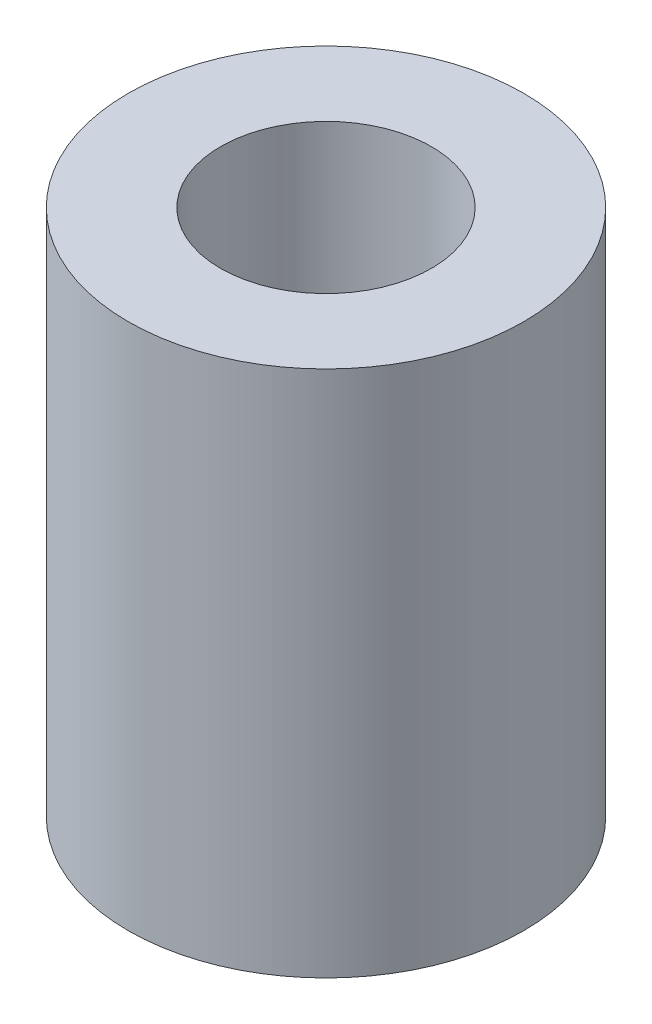
ISO-10303-21;
HEADER;
FILE_DESCRIPTION(('STEP AP214'),'2;1');
FILE_NAME('part.step','',(''),(''),'','','');
FILE_SCHEMA(('AUTOMOTIVE_DESIGN { 1 0 10303 214 1 1 1 1 }'));
ENDSEC;
DATA;
#1=APPLICATION_CONTEXT('core data for automotive mechanical design processes');
#2=APPLICATION_PROTOCOL_DEFINITION('international standard','automotive_design',2000,#1);
#3=PRODUCT_CONTEXT('',#1,'mechanical');
#4=PRODUCT('Part','Part','',(#3));
#5=PRODUCT_RELATED_PRODUCT_CATEGORY('part','',(#4));
#6=PRODUCT_DEFINITION_FORMATION('','',#4);
#7=PRODUCT_DEFINITION_CONTEXT('part definition',#1,'design');
#8=PRODUCT_DEFINITION('design','',#6,#7);
#9=PRODUCT_DEFINITION_SHAPE('','',#8);
#10=(LENGTH_UNIT() NAMED_UNIT(*) SI_UNIT(.MILLI.,.METRE.));
#11=(NAMED_UNIT(*) PLANE_ANGLE_UNIT() SI_UNIT($,.RADIAN.));
#12=(NAMED_UNIT(*) SI_UNIT($,.STERADIAN.) SOLID_ANGLE_UNIT());
#13=UNCERTAINTY_MEASURE_WITH_UNIT(LENGTH_MEASURE(1.E-05),#10,'distance_accuracy_value','');
#14=(GEOMETRIC_REPRESENTATION_CONTEXT(3) GLOBAL_UNCERTAINTY_ASSIGNED_CONTEXT((#13)) GLOBAL_UNIT_ASSIGNED_CONTEXT((#10,
#11,#12)) REPRESENTATION_CONTEXT('',''));
#15=CARTESIAN_POINT('',(0.,0.,0.));
#16=DIRECTION('',(0.,0.,1.));
#17=DIRECTION('',(1.,0.,0.));
#18=AXIS2_PLACEMENT_3D('',#15,#16,#17);
#19=CARTESIAN_POINT('',(0.,-20.,0.));
#20=DIRECTION('',(0.,1.,0.));
#21=DIRECTION('',(0.,0.,1.));
#22=AXIS2_PLACEMENT_3D('',#19,#20,#21);
#23=CYLINDRICAL_SURFACE('',#22,7.5);
#24=CARTESIAN_POINT('',(0.,-20.,0.));
#25=DIRECTION('',(0.,1.,0.));
#26=DIRECTION('',(0.,0.,1.));
#27=AXIS2_PLACEMENT_3D('',#24,#25,#26);
#28=CIRCLE('',#27,7.5);
#29=CARTESIAN_POINT('',(0.,-20.,7.5));
#30=VERTEX_POINT('',#29);
#31=EDGE_CURVE('E10',#30,#30,#28,.T.);
#32=ORIENTED_EDGE('',*,*,#31,.T.);
#33=EDGE_LOOP('',(#32));
#34=FACE_BOUND('',#33,.T.);
#35=CARTESIAN_POINT('',(0.,0.,0.));
#36=DIRECTION('',(0.,1.,0.));
#37=DIRECTION('',(0.,0.,1.));
#38=AXIS2_PLACEMENT_3D('',#35,#36,#37);
#39=CIRCLE('',#38,7.5);
#40=CARTESIAN_POINT('',(0.,0.,7.5));
#41=VERTEX_POINT('',#40);
#42=EDGE_CURVE('E40',#41,#41,#39,.T.);
#43=ORIENTED_EDGE('',*,*,#42,.F.);
#44=EDGE_LOOP('',(#43));
#45=FACE_BOUND('',#44,.T.);
#46=ADVANCED_FACE('F37',(#34,#45),#23,.T.);
#47=CARTESIAN_POINT('',(0.,-20.,0.));
#48=DIRECTION('',(0.,1.,0.));
#49=DIRECTION('',(0.,0.,1.));
#50=AXIS2_PLACEMENT_3D('',#47,#48,#49);
#51=PLANE('',#50);
#52=CARTESIAN_POINT('',(0.,-20.,0.));
#53=DIRECTION('',(0.,1.,0.));
#54=DIRECTION('',(0.,0.,1.));
#55=AXIS2_PLACEMENT_3D('',#52,#53,#54);
#56=CIRCLE('',#55,4.);
#57=CARTESIAN_POINT('',(0.,-20.,4.));
#58=VERTEX_POINT('',#57);
#59=EDGE_CURVE('E49',#58,#58,#56,.T.);
#60=ORIENTED_EDGE('',*,*,#59,.T.);
#61=EDGE_LOOP('',(#60));
#62=FACE_BOUND('',#61,.T.);
#63=ORIENTED_EDGE('',*,*,#31,.F.);
#64=EDGE_LOOP('',(#63));
#65=FACE_BOUND('',#64,.T.);
#66=ADVANCED_FACE('F65',(#62,#65),#51,.F.);
#67=CARTESIAN_POINT('',(0.,0.,0.));
#68=DIRECTION('',(0.,1.,0.));
#69=DIRECTION('',(0.,0.,1.));
#70=AXIS2_PLACEMENT_3D('',#67,#68,#69);
#71=PLANE('',#70);
#72=CARTESIAN_POINT('',(0.,0.,0.));
#73=DIRECTION('',(0.,1.,0.));
#74=DIRECTION('',(0.,0.,1.));
#75=AXIS2_PLACEMENT_3D('',#72,#73,#74);
#76=CIRCLE('',#75,4.);
#77=CARTESIAN_POINT('',(0.,0.,4.));
#78=VERTEX_POINT('',#77);
#79=EDGE_CURVE('E54',#78,#78,#76,.T.);
#80=ORIENTED_EDGE('',*,*,#79,.F.);
#81=EDGE_LOOP('',(#80));
#82=FACE_BOUND('',#81,.T.);
#83=ORIENTED_EDGE('',*,*,#42,.T.);
#84=EDGE_LOOP('',(#83));
#85=FACE_BOUND('',#84,.T.);
#86=ADVANCED_FACE('F62',(#82,#85),#71,.T.);
#87=CARTESIAN_POINT('',(0.,-21.36,0.));
#88=DIRECTION('',(0.,1.,0.));
#89=DIRECTION('',(0.,0.,1.));
#90=AXIS2_PLACEMENT_3D('',#87,#88,#89);
#91=CYLINDRICAL_SURFACE('',#90,4.);
#92=CARTESIAN_POINT('',(0.,0.,4.));
#93=CARTESIAN_POINT('',(0.,-0.208333333333334,4.));
#94=CARTESIAN_POINT('',(0.,-0.416666666666667,4.));
#95=CARTESIAN_POINT('',(0.,-0.833333333333334,4.));
#96=CARTESIAN_POINT('',(0.,-1.04166666666667,4.));
#97=CARTESIAN_POINT('',(0.,-1.45833333333333,4.));
#98=CARTESIAN_POINT('',(0.,-1.66666666666667,4.));
#99=CARTESIAN_POINT('',(0.,-2.08333333333334,4.));
#100=CARTESIAN_POINT('',(0.,-2.29166666666667,4.));
#101=CARTESIAN_POINT('',(0.,-2.70833333333333,4.));
#102=CARTESIAN_POINT('',(0.,-2.91666666666667,4.));
#103=CARTESIAN_POINT('',(0.,-3.33333333333333,4.));
#104=CARTESIAN_POINT('',(0.,-3.54166666666667,4.));
#105=CARTESIAN_POINT('',(0.,-3.95833333333333,4.));
#106=CARTESIAN_POINT('',(0.,-4.16666666666667,4.));
#107=CARTESIAN_POINT('',(0.,-4.58333333333333,4.));
#108=CARTESIAN_POINT('',(0.,-4.79166666666667,4.));
#109=CARTESIAN_POINT('',(0.,-5.20833333333333,4.));
#110=CARTESIAN_POINT('',(0.,-5.41666666666667,4.));
#111=CARTESIAN_POINT('',(0.,-5.83333333333333,4.));
#112=CARTESIAN_POINT('',(0.,-6.04166666666667,4.));
#113=CARTESIAN_POINT('',(0.,-6.45833333333333,4.));
#114=CARTESIAN_POINT('',(0.,-6.66666666666667,4.));
#115=CARTESIAN_POINT('',(0.,-7.08333333333333,4.));
#116=CARTESIAN_POINT('',(0.,-7.29166666666667,4.));
#117=CARTESIAN_POINT('',(0.,-7.70833333333333,4.));
#118=CARTESIAN_POINT('',(0.,-7.91666666666667,4.));
#119=CARTESIAN_POINT('',(0.,-8.33333333333333,4.));
#120=CARTESIAN_POINT('',(0.,-8.54166666666667,4.));
#121=CARTESIAN_POINT('',(0.,-8.95833333333333,4.));
#122=CARTESIAN_POINT('',(0.,-9.16666666666667,4.));
#123=CARTESIAN_POINT('',(0.,-9.58333333333333,4.));
#124=CARTESIAN_POINT('',(0.,-9.79166666666667,4.));
#125=CARTESIAN_POINT('',(0.,-10.2083333333333,4.));
#126=CARTESIAN_POINT('',(0.,-10.4166666666667,4.));
#127=CARTESIAN_POINT('',(0.,-10.8333333333333,4.));
#128=CARTESIAN_POINT('',(0.,-11.0416666666667,4.));
#129=CARTESIAN_POINT('',(0.,-11.4583333333333,4.));
#130=CARTESIAN_POINT('',(0.,-11.6666666666667,4.));
#131=CARTESIAN_POINT('',(0.,-12.0833333333333,4.));
#132=CARTESIAN_POINT('',(0.,-12.2916666666667,4.));
#133=CARTESIAN_POINT('',(0.,-12.7083333333333,4.));
#134=CARTESIAN_POINT('',(0.,-12.9166666666667,4.));
#135=CARTESIAN_POINT('',(0.,-13.3333333333333,4.));
#136=CARTESIAN_POINT('',(0.,-13.5416666666667,4.));
#137=CARTESIAN_POINT('',(0.,-13.9583333333333,4.));
#138=CARTESIAN_POINT('',(0.,-14.1666666666667,4.));
#139=CARTESIAN_POINT('',(0.,-14.5833333333333,4.));
#140=CARTESIAN_POINT('',(0.,-14.7916666666667,4.));
#141=CARTESIAN_POINT('',(0.,-15.2083333333333,4.));
#142=CARTESIAN_POINT('',(0.,-15.4166666666667,4.));
#143=CARTESIAN_POINT('',(0.,-15.8333333333333,4.));
#144=CARTESIAN_POINT('',(0.,-16.0416666666667,4.));
#145=CARTESIAN_POINT('',(0.,-16.4583333333333,4.));
#146=CARTESIAN_POINT('',(0.,-16.6666666666667,4.));
#147=CARTESIAN_POINT('',(0.,-17.0833333333333,4.));
#148=CARTESIAN_POINT('',(0.,-17.2916666666667,4.));
#149=CARTESIAN_POINT('',(0.,-17.7083333333333,4.));
#150=CARTESIAN_POINT('',(0.,-17.9166666666667,4.));
#151=CARTESIAN_POINT('',(0.,-18.3333333333333,4.));
#152=CARTESIAN_POINT('',(0.,-18.5416666666667,4.));
#153=CARTESIAN_POINT('',(0.,-18.9583333333333,4.));
#154=CARTESIAN_POINT('',(0.,-19.1666666666667,4.));
#155=CARTESIAN_POINT('',(0.,-19.5833333333333,4.));
#156=CARTESIAN_POINT('',(0.,-19.7916666666667,4.));
#157=CARTESIAN_POINT('',(0.,-20.,4.));
#158=B_SPLINE_CURVE_WITH_KNOTS('',3,(#92,#93,#94,#95,#96,#97,#98,#99,#100,#101,#102,#103,#104,
#105,#106,#107,#108,#109,#110,#111,#112,#113,#114,#115,#116,#117,#118,#119,#120,#121,#122,#123,
#124,#125,#126,#127,#128,#129,#130,#131,#132,#133,#134,#135,#136,#137,#138,#139,#140,#141,#142,
#143,#144,#145,#146,#147,#148,#149,#150,#151,#152,#153,#154,#155,#156,#157),.UNSPECIFIED.,.F.,
.F.,(4,2,2,2,2,2,2,2,2,2,2,2,2,2,2,2,2,2,2,2,2,2,2,2,2,2,2,2,2,2,2,2,4),(0.,0.625000000000001,
1.25,1.875,2.5,3.125,3.75,4.375,5.,5.625,6.25,6.875,7.5,8.125,8.75,9.375,10.,10.625,11.25,
11.875,12.5,13.125,13.75,14.375,15.,15.625,16.25,16.875,17.5,18.125,18.75,19.375,20.),.UNSPECIFIED.);
#159=EDGE_CURVE('BSEAM59',#78,#58,#158,.T.);
#160=ORIENTED_EDGE('',*,*,#79,.T.);
#161=ORIENTED_EDGE('',*,*,#59,.F.);
#162=ORIENTED_EDGE('',*,*,#159,.T.);
#163=ORIENTED_EDGE('',*,*,#159,.F.);
#164=EDGE_LOOP('',(#160,#162,#161,#163));
#165=FACE_BOUND('',#164,.T.);
#166=ADVANCED_FACE('F59',(#165),#91,.F.);
#167=CLOSED_SHELL('',(#46,#66,#86,#166));
#168=MANIFOLD_SOLID_BREP('B2',#167);
#169=ADVANCED_BREP_SHAPE_REPRESENTATION('',(#18,#168),#14);
#170=SHAPE_DEFINITION_REPRESENTATION(#9,#169);
ENDSEC;
END-ISO-10303-21;
